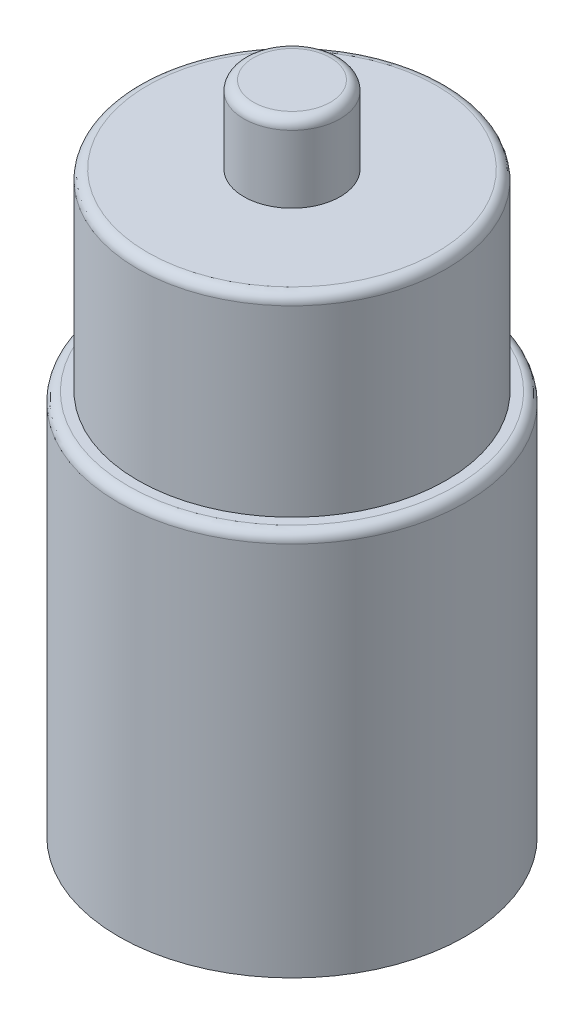
ISO-10303-21;
HEADER;
FILE_DESCRIPTION(('STEP AP214'),'2;1');
FILE_NAME('part.step','',(''),(''),'','','');
FILE_SCHEMA(('AUTOMOTIVE_DESIGN { 1 0 10303 214 1 1 1 1 }'));
ENDSEC;
DATA;
#1=APPLICATION_CONTEXT('core data for automotive mechanical design processes');
#2=APPLICATION_PROTOCOL_DEFINITION('international standard','automotive_design',2000,#1);
#3=PRODUCT_CONTEXT('',#1,'mechanical');
#4=PRODUCT('Part','Part','',(#3));
#5=PRODUCT_RELATED_PRODUCT_CATEGORY('part','',(#4));
#6=PRODUCT_DEFINITION_FORMATION('','',#4);
#7=PRODUCT_DEFINITION_CONTEXT('part definition',#1,'design');
#8=PRODUCT_DEFINITION('design','',#6,#7);
#9=PRODUCT_DEFINITION_SHAPE('','',#8);
#10=(LENGTH_UNIT() NAMED_UNIT(*) SI_UNIT(.MILLI.,.METRE.));
#11=(NAMED_UNIT(*) PLANE_ANGLE_UNIT() SI_UNIT($,.RADIAN.));
#12=(NAMED_UNIT(*) SI_UNIT($,.STERADIAN.) SOLID_ANGLE_UNIT());
#13=UNCERTAINTY_MEASURE_WITH_UNIT(LENGTH_MEASURE(1.E-05),#10,'distance_accuracy_value','');
#14=(GEOMETRIC_REPRESENTATION_CONTEXT(3) GLOBAL_UNCERTAINTY_ASSIGNED_CONTEXT((#13)) GLOBAL_UNIT_ASSIGNED_CONTEXT((#10,
#11,#12)) REPRESENTATION_CONTEXT('',''));
#15=CARTESIAN_POINT('',(0.,0.,0.));
#16=DIRECTION('',(0.,0.,1.));
#17=DIRECTION('',(1.,0.,0.));
#18=AXIS2_PLACEMENT_3D('',#15,#16,#17);
#19=CARTESIAN_POINT('',(-1.11022302462516E-13,20.,0.));
#20=DIRECTION('',(0.,-1.,0.));
#21=DIRECTION('',(0.,0.,-1.));
#22=AXIS2_PLACEMENT_3D('',#19,#20,#21);
#23=CYLINDRICAL_SURFACE('',#22,9.);
#24=CARTESIAN_POINT('',(-1.11022302462516E-13,19.5000000000001,0.));
#25=DIRECTION('',(0.,1.,0.));
#26=DIRECTION('',(0.,0.,1.));
#27=AXIS2_PLACEMENT_3D('',#24,#25,#26);
#28=CIRCLE('',#27,9.);
#29=CARTESIAN_POINT('',(-1.10647602191705E-13,19.5000000000001,9.));
#30=VERTEX_POINT('',#29);
#31=EDGE_CURVE('E60',#30,#30,#28,.F.);
#32=ORIENTED_EDGE('',*,*,#31,.T.);
#33=EDGE_LOOP('',(#32));
#34=FACE_BOUND('',#33,.T.);
#35=CARTESIAN_POINT('',(0.,0.,0.));
#36=DIRECTION('',(0.,1.,0.));
#37=DIRECTION('',(0.,0.,1.));
#38=AXIS2_PLACEMENT_3D('',#35,#36,#37);
#39=CIRCLE('',#38,9.);
#40=CARTESIAN_POINT('',(0.,0.,9.));
#41=VERTEX_POINT('',#40);
#42=EDGE_CURVE('E67',#41,#41,#39,.T.);
#43=ORIENTED_EDGE('',*,*,#42,.T.);
#44=EDGE_LOOP('',(#43));
#45=FACE_BOUND('',#44,.T.);
#46=ADVANCED_FACE('F40',(#34,#45),#23,.T.);
#47=CARTESIAN_POINT('',(-1.11022302462516E-13,20.,0.));
#48=DIRECTION('',(0.,1.,0.));
#49=DIRECTION('',(0.,0.,1.));
#50=AXIS2_PLACEMENT_3D('',#47,#48,#49);
#51=PLANE('',#50);
#52=CARTESIAN_POINT('',(-1.11022302462516E-13,20.,0.));
#53=DIRECTION('',(0.,1.,0.));
#54=DIRECTION('',(0.,0.,1.));
#55=AXIS2_PLACEMENT_3D('',#52,#53,#54);
#56=CIRCLE('',#55,8.5);
#57=CARTESIAN_POINT('',(-1.10668418873416E-13,20.,8.5));
#58=VERTEX_POINT('',#57);
#59=EDGE_CURVE('E63',#58,#58,#56,.T.);
#60=ORIENTED_EDGE('',*,*,#59,.T.);
#61=EDGE_LOOP('',(#60));
#62=FACE_BOUND('',#61,.T.);
#63=CARTESIAN_POINT('',(-1.11022302462516E-13,20.,0.));
#64=DIRECTION('',(0.,1.,0.));
#65=DIRECTION('',(0.,0.,1.));
#66=AXIS2_PLACEMENT_3D('',#63,#64,#65);
#67=CIRCLE('',#66,8.);
#68=CARTESIAN_POINT('',(-1.10689235555128E-13,20.,8.));
#69=VERTEX_POINT('',#68);
#70=EDGE_CURVE('E70',#69,#69,#67,.T.);
#71=ORIENTED_EDGE('',*,*,#70,.F.);
#72=EDGE_LOOP('',(#71));
#73=FACE_BOUND('',#72,.T.);
#74=ADVANCED_FACE('F93',(#62,#73),#51,.T.);
#75=CARTESIAN_POINT('',(0.,0.,0.));
#76=DIRECTION('',(0.,1.,0.));
#77=DIRECTION('',(0.,0.,1.));
#78=AXIS2_PLACEMENT_3D('',#75,#76,#77);
#79=PLANE('',#78);
#80=ORIENTED_EDGE('',*,*,#42,.F.);
#81=EDGE_LOOP('',(#80));
#82=FACE_BOUND('',#81,.T.);
#83=ADVANCED_FACE('F89',(#82),#79,.F.);
#84=CARTESIAN_POINT('',(-1.11022302462516E-13,30.0000000000001,0.));
#85=DIRECTION('',(0.,-1.,0.));
#86=DIRECTION('',(0.,0.,-1.));
#87=AXIS2_PLACEMENT_3D('',#84,#85,#86);
#88=CYLINDRICAL_SURFACE('',#87,8.);
#89=CARTESIAN_POINT('',(-1.11022302462516E-13,29.5,0.));
#90=DIRECTION('',(0.,1.,0.));
#91=DIRECTION('',(0.,0.,1.));
#92=AXIS2_PLACEMENT_3D('',#89,#90,#91);
#93=CIRCLE('',#92,8.);
#94=CARTESIAN_POINT('',(-1.10689235555128E-13,29.5,8.));
#95=VERTEX_POINT('',#94);
#96=EDGE_CURVE('E51',#95,#95,#93,.F.);
#97=ORIENTED_EDGE('',*,*,#96,.T.);
#98=EDGE_LOOP('',(#97));
#99=FACE_BOUND('',#98,.T.);
#100=ORIENTED_EDGE('',*,*,#70,.T.);
#101=EDGE_LOOP('',(#100));
#102=FACE_BOUND('',#101,.T.);
#103=ADVANCED_FACE('F80',(#99,#102),#88,.T.);
#104=CARTESIAN_POINT('',(-1.11022302462516E-13,30.0000000000001,0.));
#105=DIRECTION('',(0.,1.,0.));
#106=DIRECTION('',(0.,0.,1.));
#107=AXIS2_PLACEMENT_3D('',#104,#105,#106);
#108=PLANE('',#107);
#109=CARTESIAN_POINT('',(-1.11022302462516E-13,30.0000000000001,0.));
#110=DIRECTION('',(0.,1.,0.));
#111=DIRECTION('',(0.,0.,1.));
#112=AXIS2_PLACEMENT_3D('',#109,#110,#111);
#113=CIRCLE('',#112,7.5);
#114=CARTESIAN_POINT('',(-1.1071005223684E-13,30.0000000000001,7.5));
#115=VERTEX_POINT('',#114);
#116=EDGE_CURVE('E55',#115,#115,#113,.T.);
#117=ORIENTED_EDGE('',*,*,#116,.T.);
#118=EDGE_LOOP('',(#117));
#119=FACE_BOUND('',#118,.T.);
#120=CARTESIAN_POINT('',(-1.11022302462516E-13,30.0000000000001,0.));
#121=DIRECTION('',(0.,1.,0.));
#122=DIRECTION('',(0.,0.,1.));
#123=AXIS2_PLACEMENT_3D('',#120,#121,#122);
#124=CIRCLE('',#123,2.5);
#125=CARTESIAN_POINT('',(-1.10918219053957E-13,30.0000000000001,2.5));
#126=VERTEX_POINT('',#125);
#127=EDGE_CURVE('E66',#126,#126,#124,.T.);
#128=ORIENTED_EDGE('',*,*,#127,.F.);
#129=EDGE_LOOP('',(#128));
#130=FACE_BOUND('',#129,.T.);
#131=ADVANCED_FACE('F78',(#119,#130),#108,.T.);
#132=CARTESIAN_POINT('',(0.,34.,0.));
#133=DIRECTION('',(0.,-1.,0.));
#134=DIRECTION('',(0.,0.,-1.));
#135=AXIS2_PLACEMENT_3D('',#132,#133,#134);
#136=CYLINDRICAL_SURFACE('',#135,2.5);
#137=CARTESIAN_POINT('',(0.,33.5,0.));
#138=DIRECTION('',(0.,1.,0.));
#139=DIRECTION('',(0.,0.,1.));
#140=AXIS2_PLACEMENT_3D('',#137,#138,#139);
#141=CIRCLE('',#140,2.5);
#142=CARTESIAN_POINT('',(0.,33.5,2.50000000000001));
#143=VERTEX_POINT('',#142);
#144=EDGE_CURVE('E10',#143,#143,#141,.F.);
#145=ORIENTED_EDGE('',*,*,#144,.T.);
#146=EDGE_LOOP('',(#145));
#147=FACE_BOUND('',#146,.T.);
#148=ORIENTED_EDGE('',*,*,#127,.T.);
#149=EDGE_LOOP('',(#148));
#150=FACE_BOUND('',#149,.T.);
#151=ADVANCED_FACE('F76',(#147,#150),#136,.T.);
#152=CARTESIAN_POINT('',(0.,34.,0.));
#153=DIRECTION('',(0.,1.,0.));
#154=DIRECTION('',(0.,0.,1.));
#155=AXIS2_PLACEMENT_3D('',#152,#153,#154);
#156=PLANE('',#155);
#157=CARTESIAN_POINT('',(0.,34.,0.));
#158=DIRECTION('',(0.,1.,0.));
#159=DIRECTION('',(0.,0.,1.));
#160=AXIS2_PLACEMENT_3D('',#157,#158,#159);
#161=CIRCLE('',#160,2.);
#162=CARTESIAN_POINT('',(0.,34.,2.));
#163=VERTEX_POINT('',#162);
#164=EDGE_CURVE('E47',#163,#163,#161,.T.);
#165=ORIENTED_EDGE('',*,*,#164,.T.);
#166=EDGE_LOOP('',(#165));
#167=FACE_BOUND('',#166,.T.);
#168=ADVANCED_FACE('F87',(#167),#156,.T.);
#169=CARTESIAN_POINT('',(-1.11022302462516E-13,19.5000000000001,0.));
#170=DIRECTION('',(0.,1.,0.));
#171=DIRECTION('',(0.,0.,1.));
#172=AXIS2_PLACEMENT_3D('',#169,#170,#171);
#173=TOROIDAL_SURFACE('',#172,8.5,0.5);
#174=ORIENTED_EDGE('',*,*,#31,.F.);
#175=EDGE_LOOP('',(#174));
#176=FACE_BOUND('',#175,.T.);
#177=ORIENTED_EDGE('',*,*,#59,.F.);
#178=EDGE_LOOP('',(#177));
#179=FACE_BOUND('',#178,.T.);
#180=ADVANCED_FACE('F104',(#176,#179),#173,.T.);
#181=CARTESIAN_POINT('',(-1.11022302462516E-13,29.5,0.));
#182=DIRECTION('',(0.,1.,0.));
#183=DIRECTION('',(0.,0.,1.));
#184=AXIS2_PLACEMENT_3D('',#181,#182,#183);
#185=TOROIDAL_SURFACE('',#184,7.5,0.5);
#186=ORIENTED_EDGE('',*,*,#96,.F.);
#187=EDGE_LOOP('',(#186));
#188=FACE_BOUND('',#187,.T.);
#189=ORIENTED_EDGE('',*,*,#116,.F.);
#190=EDGE_LOOP('',(#189));
#191=FACE_BOUND('',#190,.T.);
#192=ADVANCED_FACE('F106',(#188,#191),#185,.T.);
#193=CARTESIAN_POINT('',(0.,33.5,0.));
#194=DIRECTION('',(0.,1.,0.));
#195=DIRECTION('',(0.,0.,1.));
#196=AXIS2_PLACEMENT_3D('',#193,#194,#195);
#197=TOROIDAL_SURFACE('',#196,2.,0.5);
#198=ORIENTED_EDGE('',*,*,#144,.F.);
#199=EDGE_LOOP('',(#198));
#200=FACE_BOUND('',#199,.T.);
#201=ORIENTED_EDGE('',*,*,#164,.F.);
#202=EDGE_LOOP('',(#201));
#203=FACE_BOUND('',#202,.T.);
#204=ADVANCED_FACE('F42',(#200,#203),#197,.T.);
#205=CLOSED_SHELL('',(#46,#74,#83,#103,#131,#151,#168,#180,#192,#204));
#206=MANIFOLD_SOLID_BREP('B2',#205);
#207=ADVANCED_BREP_SHAPE_REPRESENTATION('',(#18,#206),#14);
#208=SHAPE_DEFINITION_REPRESENTATION(#9,#207);
ENDSEC;
END-ISO-10303-21;
